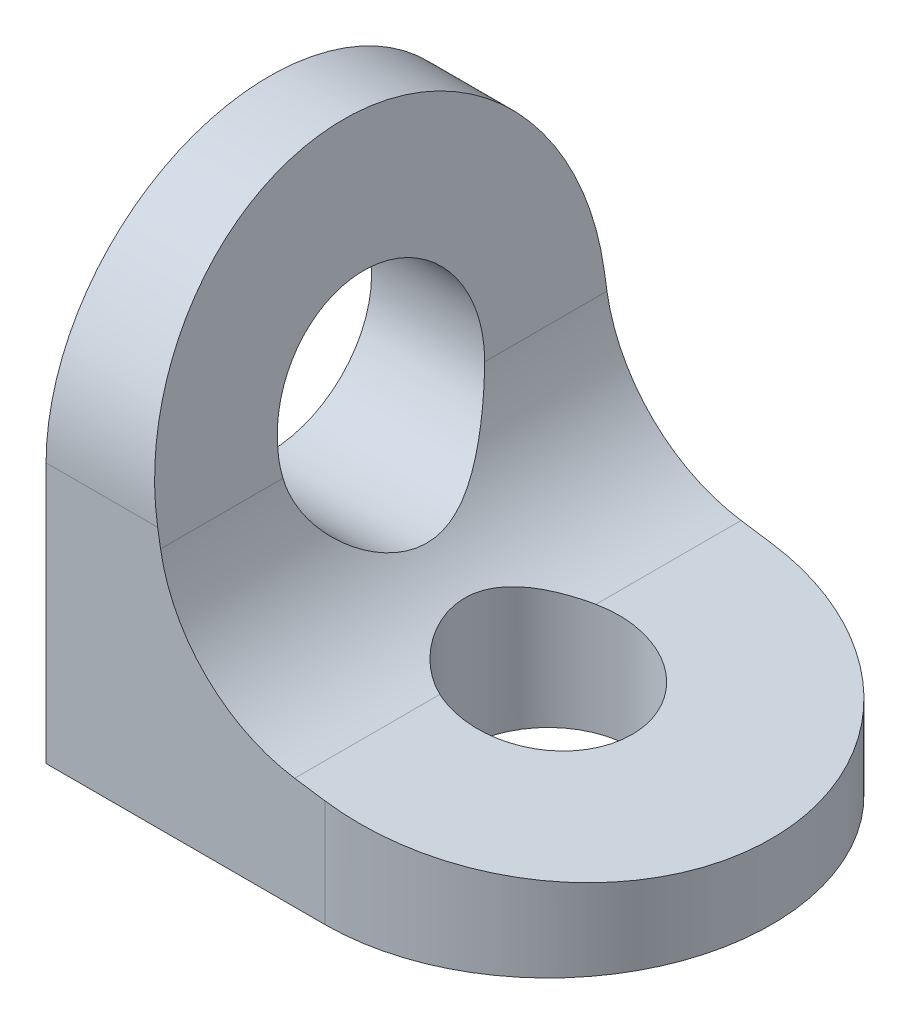
ISO-10303-21;
HEADER;
FILE_DESCRIPTION(('STEP AP214'),'2;1');
FILE_NAME('part.step','',(''),(''),'','','');
FILE_SCHEMA(('AUTOMOTIVE_DESIGN { 1 0 10303 214 1 1 1 1 }'));
ENDSEC;
DATA;
#1=APPLICATION_CONTEXT('core data for automotive mechanical design processes');
#2=APPLICATION_PROTOCOL_DEFINITION('international standard','automotive_design',2000,#1);
#3=PRODUCT_CONTEXT('',#1,'mechanical');
#4=PRODUCT('Part','Part','',(#3));
#5=PRODUCT_RELATED_PRODUCT_CATEGORY('part','',(#4));
#6=PRODUCT_DEFINITION_FORMATION('','',#4);
#7=PRODUCT_DEFINITION_CONTEXT('part definition',#1,'design');
#8=PRODUCT_DEFINITION('design','',#6,#7);
#9=PRODUCT_DEFINITION_SHAPE('','',#8);
#10=(LENGTH_UNIT() NAMED_UNIT(*) SI_UNIT(.MILLI.,.METRE.));
#11=(NAMED_UNIT(*) PLANE_ANGLE_UNIT() SI_UNIT($,.RADIAN.));
#12=(NAMED_UNIT(*) SI_UNIT($,.STERADIAN.) SOLID_ANGLE_UNIT());
#13=UNCERTAINTY_MEASURE_WITH_UNIT(LENGTH_MEASURE(1.E-05),#10,'distance_accuracy_value','');
#14=(GEOMETRIC_REPRESENTATION_CONTEXT(3) GLOBAL_UNCERTAINTY_ASSIGNED_CONTEXT((#13)) GLOBAL_UNIT_ASSIGNED_CONTEXT((#10,
#11,#12)) REPRESENTATION_CONTEXT('',''));
#15=CARTESIAN_POINT('',(0.,0.,0.));
#16=DIRECTION('',(0.,0.,1.));
#17=DIRECTION('',(1.,0.,0.));
#18=AXIS2_PLACEMENT_3D('',#15,#16,#17);
#19=CARTESIAN_POINT('',(7.5,0.,0.));
#20=DIRECTION('',(0.,1.,0.));
#21=DIRECTION('',(0.,0.,1.));
#22=AXIS2_PLACEMENT_3D('',#19,#20,#21);
#23=CYLINDRICAL_SURFACE('',#22,6.);
#24=DIRECTION('',(0.,-1.,0.));
#25=VECTOR('',#24,1.);
#26=CARTESIAN_POINT('',(7.5,0.,6.));
#27=LINE('',#26,#25);
#28=CARTESIAN_POINT('',(7.5,0.,6.));
#29=VERTEX_POINT('',#28);
#30=CARTESIAN_POINT('',(7.5,2.88010243541644,6.));
#31=VERTEX_POINT('',#30);
#32=EDGE_CURVE('E148',#29,#31,#27,.F.);
#33=ORIENTED_EDGE('',*,*,#32,.F.);
#34=CARTESIAN_POINT('',(7.5,0.,0.));
#35=DIRECTION('',(0.,1.,0.));
#36=DIRECTION('',(-1.,0.,0.));
#37=AXIS2_PLACEMENT_3D('',#34,#35,#36);
#38=CIRCLE('',#37,6.);
#39=CARTESIAN_POINT('',(7.5,0.,-6.));
#40=VERTEX_POINT('',#39);
#41=EDGE_CURVE('E154',#40,#29,#38,.F.);
#42=ORIENTED_EDGE('',*,*,#41,.F.);
#43=DIRECTION('',(0.,1.,0.));
#44=VECTOR('',#43,1.);
#45=CARTESIAN_POINT('',(7.5,7.240095636341,-6.));
#46=LINE('',#45,#44);
#47=CARTESIAN_POINT('',(7.5,2.88010243541644,-6.));
#48=VERTEX_POINT('',#47);
#49=EDGE_CURVE('E151',#48,#40,#46,.F.);
#50=ORIENTED_EDGE('',*,*,#49,.F.);
#51=CARTESIAN_POINT('',(7.5,2.88010243541644,0.));
#52=DIRECTION('',(-0.145130723511439,-0.989412488850351,0.));
#53=DIRECTION('',(-0.989412488850351,0.145130723511439,0.));
#54=AXIS2_PLACEMENT_3D('',#51,#52,#53);
#55=ELLIPSE('',#54,6.06420483631828,6.);
#56=EDGE_CURVE('E50',#31,#48,#55,.F.);
#57=ORIENTED_EDGE('',*,*,#56,.F.);
#58=EDGE_LOOP('',(#33,#42,#50,#57));
#59=FACE_BOUND('',#58,.T.);
#60=ADVANCED_FACE('F36',(#59),#23,.T.);
#61=CARTESIAN_POINT('',(3.,7.,0.));
#62=DIRECTION('',(-1.,0.,0.));
#63=DIRECTION('',(0.,0.,1.));
#64=AXIS2_PLACEMENT_3D('',#61,#62,#63);
#65=CYLINDRICAL_SURFACE('',#64,6.);
#66=DIRECTION('',(1.,0.,0.));
#67=VECTOR('',#66,1.);
#68=CARTESIAN_POINT('',(3.,7.,6.));
#69=LINE('',#68,#67);
#70=CARTESIAN_POINT('',(3.,7.,6.));
#71=VERTEX_POINT('',#70);
#72=CARTESIAN_POINT('',(0.,7.,6.));
#73=VERTEX_POINT('',#72);
#74=EDGE_CURVE('E138',#71,#73,#69,.F.);
#75=ORIENTED_EDGE('',*,*,#74,.F.);
#76=CARTESIAN_POINT('',(3.,7.,0.));
#77=DIRECTION('',(-0.986393923832144,-0.164398987305357,0.));
#78=DIRECTION('',(-0.164398987305357,0.986393923832144,0.));
#79=AXIS2_PLACEMENT_3D('',#76,#77,#78);
#80=ELLIPSE('',#79,6.08276253029822,6.);
#81=CARTESIAN_POINT('',(3.,7.,-6.));
#82=VERTEX_POINT('',#81);
#83=EDGE_CURVE('E144',#82,#71,#80,.F.);
#84=ORIENTED_EDGE('',*,*,#83,.F.);
#85=DIRECTION('',(-1.,0.,0.));
#86=VECTOR('',#85,1.);
#87=CARTESIAN_POINT('',(7.30456483493455,7.,-6.));
#88=LINE('',#87,#86);
#89=CARTESIAN_POINT('',(0.,7.,-6.));
#90=VERTEX_POINT('',#89);
#91=EDGE_CURVE('E141',#90,#82,#88,.F.);
#92=ORIENTED_EDGE('',*,*,#91,.F.);
#93=CARTESIAN_POINT('',(0.,7.,0.));
#94=DIRECTION('',(1.,0.,0.));
#95=DIRECTION('',(0.,0.,-1.));
#96=AXIS2_PLACEMENT_3D('',#93,#94,#95);
#97=CIRCLE('',#96,6.);
#98=EDGE_CURVE('E146',#73,#90,#97,.F.);
#99=ORIENTED_EDGE('',*,*,#98,.F.);
#100=EDGE_LOOP('',(#75,#84,#92,#99));
#101=FACE_BOUND('',#100,.T.);
#102=ADVANCED_FACE('F207',(#101),#65,.T.);
#103=CARTESIAN_POINT('',(13.5,0.,6.));
#104=DIRECTION('',(0.,1.,0.));
#105=DIRECTION('',(-1.,0.,0.));
#106=AXIS2_PLACEMENT_3D('',#103,#104,#105);
#107=PLANE('',#106);
#108=CARTESIAN_POINT('',(7.5,0.,0.));
#109=DIRECTION('',(0.,-1.,0.));
#110=DIRECTION('',(1.,0.,0.));
#111=AXIS2_PLACEMENT_3D('',#108,#109,#110);
#112=CIRCLE('',#111,2.25);
#113=CARTESIAN_POINT('',(9.75,0.,0.));
#114=VERTEX_POINT('',#113);
#115=EDGE_CURVE('E124',#114,#114,#112,.T.);
#116=ORIENTED_EDGE('',*,*,#115,.F.);
#117=EDGE_LOOP('',(#116));
#118=FACE_BOUND('',#117,.T.);
#119=DIRECTION('',(1.,0.,0.));
#120=VECTOR('',#119,1.);
#121=CARTESIAN_POINT('',(13.5,0.,-6.));
#122=LINE('',#121,#120);
#123=CARTESIAN_POINT('',(0.,0.,-6.));
#124=VERTEX_POINT('',#123);
#125=EDGE_CURVE('E174',#124,#40,#122,.T.);
#126=ORIENTED_EDGE('',*,*,#125,.T.);
#127=ORIENTED_EDGE('',*,*,#41,.T.);
#128=DIRECTION('',(1.,0.,0.));
#129=VECTOR('',#128,1.);
#130=CARTESIAN_POINT('',(13.5,0.,6.));
#131=LINE('',#130,#129);
#132=CARTESIAN_POINT('',(0.,0.,6.));
#133=VERTEX_POINT('',#132);
#134=EDGE_CURVE('E183',#133,#29,#131,.T.);
#135=ORIENTED_EDGE('',*,*,#134,.F.);
#136=DIRECTION('',(0.,0.,-1.));
#137=VECTOR('',#136,1.);
#138=CARTESIAN_POINT('',(0.,0.,6.));
#139=LINE('',#138,#137);
#140=EDGE_CURVE('E133',#133,#124,#139,.T.);
#141=ORIENTED_EDGE('',*,*,#140,.T.);
#142=EDGE_LOOP('',(#126,#127,#135,#141));
#143=FACE_BOUND('',#142,.T.);
#144=ADVANCED_FACE('F201',(#118,#143),#107,.F.);
#145=CARTESIAN_POINT('',(6.6826117522775,3.,6.));
#146=DIRECTION('',(-0.145130723511439,-0.989412488850351,0.));
#147=DIRECTION('',(0.989412488850351,-0.145130723511439,0.));
#148=AXIS2_PLACEMENT_3D('',#145,#146,#147);
#149=PLANE('',#148);
#150=DIRECTION('',(0.,0.,-1.));
#151=VECTOR('',#150,1.);
#152=CARTESIAN_POINT('',(6.6826117522775,3.,6.));
#153=LINE('',#152,#151);
#154=CARTESIAN_POINT('',(6.6826117522775,3.,-2.0962768072192));
#155=VERTEX_POINT('',#154);
#156=CARTESIAN_POINT('',(6.6826117522775,3.,-6.));
#157=VERTEX_POINT('',#156);
#158=EDGE_CURVE('E129',#155,#157,#153,.T.);
#159=ORIENTED_EDGE('',*,*,#158,.F.);
#160=CARTESIAN_POINT('',(7.5,2.88010243541644,0.));
#161=DIRECTION('',(-0.145130723511439,-0.989412488850351,0.));
#162=DIRECTION('',(0.989412488850351,-0.145130723511439,0.));
#163=AXIS2_PLACEMENT_3D('',#160,#161,#162);
#164=ELLIPSE('',#163,2.27407681361935,2.25);
#165=CARTESIAN_POINT('',(6.6826117522775,3.,2.0962768072192));
#166=VERTEX_POINT('',#165);
#167=EDGE_CURVE('E63',#155,#166,#164,.T.);
#168=ORIENTED_EDGE('',*,*,#167,.T.);
#169=CARTESIAN_POINT('',(6.6826117522775,3.,6.));
#170=VERTEX_POINT('',#169);
#171=EDGE_CURVE('E131',#170,#166,#153,.T.);
#172=ORIENTED_EDGE('',*,*,#171,.F.);
#173=DIRECTION('',(-0.989412488850351,0.145130723511439,0.));
#174=VECTOR('',#173,1.);
#175=CARTESIAN_POINT('',(6.6826117522775,3.,6.));
#176=LINE('',#175,#174);
#177=EDGE_CURVE('E165',#31,#170,#176,.T.);
#178=ORIENTED_EDGE('',*,*,#177,.F.);
#179=ORIENTED_EDGE('',*,*,#56,.T.);
#180=DIRECTION('',(-0.989412488850351,0.145130723511439,0.));
#181=VECTOR('',#180,1.);
#182=CARTESIAN_POINT('',(6.6826117522775,3.,-6.));
#183=LINE('',#182,#181);
#184=EDGE_CURVE('E162',#48,#157,#183,.T.);
#185=ORIENTED_EDGE('',*,*,#184,.T.);
#186=EDGE_LOOP('',(#159,#168,#172,#178,#179,#185));
#187=FACE_BOUND('',#186,.T.);
#188=ADVANCED_FACE('F160',(#187),#149,.F.);
#189=CARTESIAN_POINT('',(7.30456483493455,7.240095636341,6.));
#190=DIRECTION('',(0.,0.,-1.));
#191=DIRECTION('',(-1.,0.,0.));
#192=AXIS2_PLACEMENT_3D('',#189,#190,#191);
#193=CYLINDRICAL_SURFACE('',#192,4.28546807739185);
#194=DIRECTION('',(0.,0.,-1.));
#195=VECTOR('',#194,1.);
#196=CARTESIAN_POINT('',(3.07740516261861,6.53556902428835,6.));
#197=LINE('',#196,#195);
#198=CARTESIAN_POINT('',(3.07740516261861,6.53556902428835,-2.71049882287367));
#199=VERTEX_POINT('',#198);
#200=CARTESIAN_POINT('',(3.07740516261861,6.53556902428835,-6.));
#201=VERTEX_POINT('',#200);
#202=EDGE_CURVE('E123',#199,#201,#197,.T.);
#203=ORIENTED_EDGE('',*,*,#202,.F.);
#204=CARTESIAN_POINT('',(3.07740516261861,6.53556902428835,-2.71049882287367));
#205=CARTESIAN_POINT('',(3.08987440764048,6.46066331149666,-2.69767525959736));
#206=CARTESIAN_POINT('',(3.10427279355863,6.38663690236073,-2.68178471042402));
#207=CARTESIAN_POINT('',(3.13654207558916,6.24092001866603,-2.64422693394715));
#208=CARTESIAN_POINT('',(3.15440942066139,6.16922724215267,-2.62256560560009));
#209=CARTESIAN_POINT('',(3.19311823790316,6.02910537502468,-2.57397120822949));
#210=CARTESIAN_POINT('',(3.21393742673688,5.96065654154899,-2.54707712081963));
#211=CARTESIAN_POINT('',(3.2582187884953,5.82683913544833,-2.48828032655013));
#212=CARTESIAN_POINT('',(3.28168159545002,5.76147130710815,-2.45637641743859));
#213=CARTESIAN_POINT('',(3.35517414566293,5.57097041047899,-2.35395104155999));
#214=CARTESIAN_POINT('',(3.40850254723425,5.45076026854337,-2.27647549931217));
#215=CARTESIAN_POINT('',(3.52033353313102,5.22495504711143,-2.10520587998474));
#216=CARTESIAN_POINT('',(3.57884974054009,5.1194004344491,-2.01136817242958));
#217=CARTESIAN_POINT('',(3.70469921832662,4.91140614937844,-1.79597196487917));
#218=CARTESIAN_POINT('',(3.77219235428233,4.81114298077279,-1.67239697500034));
#219=CARTESIAN_POINT('',(3.90200956049022,4.63241016186594,-1.40799132837073));
#220=CARTESIAN_POINT('',(3.96433928299635,4.5539164539663,-1.26717996980634));
#221=CARTESIAN_POINT('',(4.06101597742606,4.43853045895188,-1.00794578394057));
#222=CARTESIAN_POINT('',(4.09843232398134,4.39612953792535,-0.893134775889717));
#223=CARTESIAN_POINT('',(4.16153864770797,4.32653358762529,-0.655966793331067));
#224=CARTESIAN_POINT('',(4.1872490012245,4.29931211712864,-0.533623355164968));
#225=CARTESIAN_POINT('',(4.22321972631063,4.26162667333188,-0.28284085578559));
#226=CARTESIAN_POINT('',(4.23333500585242,4.25132001418111,-0.154355882917913));
#227=CARTESIAN_POINT('',(4.23566983636793,4.24892028319338,0.102943633434673));
#228=CARTESIAN_POINT('',(4.22789342660024,4.2568231003543,0.23175809597507));
#229=CARTESIAN_POINT('',(4.19804962382358,4.28795139131116,0.468786153819118));
#230=CARTESIAN_POINT('',(4.17792016683103,4.30910602762401,0.577540229174006));
#231=CARTESIAN_POINT('',(4.12778821387066,4.36351891823895,0.789600970273507));
#232=CARTESIAN_POINT('',(4.09777690903174,4.39678797438206,0.892902679995585));
#233=CARTESIAN_POINT('',(4.01516248947858,4.49224957099914,1.13947699607111));
#234=CARTESIAN_POINT('',(3.95854525976668,4.5606972136002,1.2789798309741));
#235=CARTESIAN_POINT('',(3.8382649422487,4.71822016295492,1.54261176976718));
#236=CARTESIAN_POINT('',(3.77458564815061,4.80734345049364,1.6667040667248));
#237=CARTESIAN_POINT('',(3.64524056235006,5.00649285608887,1.90065382275666));
#238=CARTESIAN_POINT('',(3.57956041748734,5.11689838463556,2.0101802599202));
#239=CARTESIAN_POINT('',(3.45312486059271,5.35599487374211,2.20995227035137));
#240=CARTESIAN_POINT('',(3.39235549796115,5.48463095559965,2.30025374527206));
#241=CARTESIAN_POINT('',(3.30854958664232,5.69006130266705,2.41926512823591));
#242=CARTESIAN_POINT('',(3.28181927023898,5.76068318633839,2.45621999367865));
#243=CARTESIAN_POINT('',(3.23139750068639,5.90576664348084,2.52419601370502));
#244=CARTESIAN_POINT('',(3.20770508839282,5.98022699458785,2.55521904264878));
#245=CARTESIAN_POINT('',(3.16375130995181,6.13317618943728,2.61109035438997));
#246=CARTESIAN_POINT('',(3.14352019200361,6.21169344099219,2.63588500762987));
#247=CARTESIAN_POINT('',(3.10720893074011,6.37163542007011,2.67853339545782));
#248=CARTESIAN_POINT('',(3.09113444197137,6.45306393846997,2.69637769152307));
#249=CARTESIAN_POINT('',(3.07740516261861,6.53556902428835,2.71049882287367));
#250=B_SPLINE_CURVE_WITH_KNOTS('',3,(#204,#205,#206,#207,#208,#209,#210,#211,#212,#213,#214,
#215,#216,#217,#218,#219,#220,#221,#222,#223,#224,#225,#226,#227,#228,#229,#230,#231,#232,#233,
#234,#235,#236,#237,#238,#239,#240,#241,#242,#243,#244,#245,#246,#247,#248,#249),.UNSPECIFIED.,
.F.,.F.,(4,2,2,2,2,2,2,2,2,2,2,2,2,2,2,2,2,2,2,2,2,2,4),(0.,0.230898062870561,0.461560998758956,
0.690567203686465,0.919628449513881,1.3755375929064,1.83268156857596,2.3490698341341,
2.86488514027074,3.2474653596652,3.62937706054055,4.01482096149634,4.40017785251238,
4.73665233598125,5.0734275750468,5.56692224270193,6.06157379830476,6.5660329617752,
7.06900461341814,7.32092156735054,7.5727587877561,7.82669536529045,8.0809755940411),.UNSPECIFIED.);
#251=CARTESIAN_POINT('',(3.07740516261861,6.53556902428835,2.71049882287367));
#252=VERTEX_POINT('',#251);
#253=EDGE_CURVE('E56',#199,#252,#250,.T.);
#254=ORIENTED_EDGE('',*,*,#253,.T.);
#255=CARTESIAN_POINT('',(3.07740516261861,6.53556902428835,6.));
#256=VERTEX_POINT('',#255);
#257=EDGE_CURVE('E120',#256,#252,#197,.T.);
#258=ORIENTED_EDGE('',*,*,#257,.F.);
#259=CARTESIAN_POINT('',(7.30456483493455,7.240095636341,6.));
#260=DIRECTION('',(0.,0.,-1.));
#261=DIRECTION('',(1.,0.,0.));
#262=AXIS2_PLACEMENT_3D('',#259,#260,#261);
#263=CIRCLE('',#262,4.28546807739185);
#264=EDGE_CURVE('E192',#170,#256,#263,.T.);
#265=ORIENTED_EDGE('',*,*,#264,.F.);
#266=ORIENTED_EDGE('',*,*,#171,.T.);
#267=CARTESIAN_POINT('',(6.6826117522775,3.,2.0962768072192));
#268=CARTESIAN_POINT('',(6.62302269416665,3.00873588391241,2.0730420086905));
#269=CARTESIAN_POINT('',(6.56461045494653,3.01859281787305,2.04733724811623));
#270=CARTESIAN_POINT('',(6.45048631815838,3.0401968075996,1.99124656053453));
#271=CARTESIAN_POINT('',(6.39477279127688,3.05194270394489,1.96086350548716));
#272=CARTESIAN_POINT('',(6.23246120551858,3.08941972856589,1.86325903797464));
#273=CARTESIAN_POINT('',(6.13028287947847,3.11745431721928,1.7894209606914));
#274=CARTESIAN_POINT('',(5.94033508274899,3.17635162439145,1.62652997803264));
#275=CARTESIAN_POINT('',(5.85253849654255,3.20720884574312,1.53750636626647));
#276=CARTESIAN_POINT('',(5.69266333427221,3.26840293752566,1.34595849669832));
#277=CARTESIAN_POINT('',(5.62060188207781,3.29873920828755,1.24341972354293));
#278=CARTESIAN_POINT('',(5.49146676878682,3.35639486371246,1.02241701180815));
#279=CARTESIAN_POINT('',(5.4351332090873,3.38353838368748,0.903470908241932));
#280=CARTESIAN_POINT('',(5.34377897278891,3.42916435156522,0.656150118119603));
#281=CARTESIAN_POINT('',(5.30873152227884,3.44765767302464,0.527787504604756));
#282=CARTESIAN_POINT('',(5.26373211819441,3.47169519414857,0.276602576011877));
#283=CARTESIAN_POINT('',(5.25194137154277,3.47818539121497,0.154202507965733));
#284=CARTESIAN_POINT('',(5.24850321182713,3.48006109151809,-0.0909485438570141));
#285=CARTESIAN_POINT('',(5.2568484893177,3.47545062433508,-0.21369938414519));
#286=CARTESIAN_POINT('',(5.29155995401261,3.45679398910078,-0.444664994089437));
#287=CARTESIAN_POINT('',(5.31627312976959,3.44361520457574,-0.553207430244121));
#288=CARTESIAN_POINT('',(5.38098195658696,3.41042475721085,-0.764512650486011));
#289=CARTESIAN_POINT('',(5.42098120006069,3.39041148830111,-0.867274069445735));
#290=CARTESIAN_POINT('',(5.51801264258134,3.34439023923402,-1.07135391730058));
#291=CARTESIAN_POINT('',(5.57596715892304,3.31808171255001,-1.1721639131797));
#292=CARTESIAN_POINT('',(5.70635221529365,3.2631678687687,-1.36335394069294));
#293=CARTESIAN_POINT('',(5.77879759366186,3.23456021552522,-1.45372313028055));
#294=CARTESIAN_POINT('',(5.94545856763213,3.17478622908905,-1.63167221787034));
#295=CARTESIAN_POINT('',(6.04119075139233,3.14368360845483,-1.7178578126447));
#296=CARTESIAN_POINT('',(6.24670040466863,3.08588352934561,-1.87302869429389));
#297=CARTESIAN_POINT('',(6.35644531966532,3.05917617888946,-1.94205278885386));
#298=CARTESIAN_POINT('',(6.50599033010685,3.02954407829237,-2.01889384903648));
#299=CARTESIAN_POINT('',(6.54069813418587,3.0231035112723,-2.03561580443161));
#300=CARTESIAN_POINT('',(6.61099882756875,3.01097407033218,-2.06728266967561));
#301=CARTESIAN_POINT('',(6.64659076593024,3.00528442708447,-2.08222939666392));
#302=CARTESIAN_POINT('',(6.68261175227745,2.99999999999998,-2.09627680721929));
#303=B_SPLINE_CURVE_WITH_KNOTS('',3,(#267,#268,#269,#270,#271,#272,#273,#274,#275,#276,#277,
#278,#279,#280,#281,#282,#283,#284,#285,#286,#287,#288,#289,#290,#291,#292,#293,#294,#295,#296,
#297,#298,#299,#300,#301,#302),.UNSPECIFIED.,.F.,.F.,(4,2,2,2,2,2,2,2,2,2,2,2,2,2,2,2,2,4),(0.,
0.193508494748534,0.386898666651203,0.772363474998494,1.15709294303915,1.54223903171104,
1.94325837373023,2.34377225874795,2.71109939148214,3.07829320327623,3.41312600281484,
3.74803754060561,4.10427235470172,4.4608738305859,4.85660721058841,5.25143739996305,
5.36857763389514,5.485596909346),.UNSPECIFIED.);
#304=EDGE_CURVE('E11',#166,#155,#303,.T.);
#305=ORIENTED_EDGE('',*,*,#304,.T.);
#306=ORIENTED_EDGE('',*,*,#158,.T.);
#307=CARTESIAN_POINT('',(7.30456483493455,7.240095636341,-6.));
#308=DIRECTION('',(0.,0.,-1.));
#309=DIRECTION('',(1.,0.,0.));
#310=AXIS2_PLACEMENT_3D('',#307,#308,#309);
#311=CIRCLE('',#310,4.28546807739185);
#312=EDGE_CURVE('E173',#157,#201,#311,.T.);
#313=ORIENTED_EDGE('',*,*,#312,.T.);
#314=EDGE_LOOP('',(#203,#254,#258,#265,#266,#305,#306,#313));
#315=FACE_BOUND('',#314,.T.);
#316=ADVANCED_FACE('F118',(#315),#193,.F.);
#317=CARTESIAN_POINT('',(2.,13.,6.));
#318=DIRECTION('',(-0.986393923832144,-0.164398987305357,0.));
#319=DIRECTION('',(0.164398987305357,-0.986393923832144,0.));
#320=AXIS2_PLACEMENT_3D('',#317,#318,#319);
#321=PLANE('',#320);
#322=ORIENTED_EDGE('',*,*,#257,.T.);
#323=CARTESIAN_POINT('',(3.,7.,0.));
#324=DIRECTION('',(-0.986393923832144,-0.164398987305357,0.));
#325=DIRECTION('',(-0.164398987305357,0.986393923832144,0.));
#326=AXIS2_PLACEMENT_3D('',#323,#324,#325);
#327=ELLIPSE('',#326,2.78793282638668,2.75);
#328=EDGE_CURVE('E109',#252,#199,#327,.T.);
#329=ORIENTED_EDGE('',*,*,#328,.T.);
#330=ORIENTED_EDGE('',*,*,#202,.T.);
#331=DIRECTION('',(-0.164398987305357,0.986393923832144,0.));
#332=VECTOR('',#331,1.);
#333=CARTESIAN_POINT('',(2.,13.,-6.));
#334=LINE('',#333,#332);
#335=EDGE_CURVE('E176',#201,#82,#334,.T.);
#336=ORIENTED_EDGE('',*,*,#335,.T.);
#337=ORIENTED_EDGE('',*,*,#83,.T.);
#338=DIRECTION('',(-0.164398987305357,0.986393923832144,0.));
#339=VECTOR('',#338,1.);
#340=CARTESIAN_POINT('',(2.,13.,6.));
#341=LINE('',#340,#339);
#342=EDGE_CURVE('E128',#256,#71,#341,.T.);
#343=ORIENTED_EDGE('',*,*,#342,.F.);
#344=EDGE_LOOP('',(#322,#329,#330,#336,#337,#343));
#345=FACE_BOUND('',#344,.T.);
#346=ADVANCED_FACE('F126',(#345),#321,.F.);
#347=CARTESIAN_POINT('',(0.,0.,6.));
#348=DIRECTION('',(1.,0.,0.));
#349=DIRECTION('',(0.,0.,-1.));
#350=AXIS2_PLACEMENT_3D('',#347,#348,#349);
#351=PLANE('',#350);
#352=CARTESIAN_POINT('',(0.,7.,0.));
#353=DIRECTION('',(-1.,0.,0.));
#354=DIRECTION('',(0.,0.,1.));
#355=AXIS2_PLACEMENT_3D('',#352,#353,#354);
#356=CIRCLE('',#355,2.75);
#357=CARTESIAN_POINT('',(0.,7.,2.75));
#358=VERTEX_POINT('',#357);
#359=EDGE_CURVE('E114',#358,#358,#356,.T.);
#360=ORIENTED_EDGE('',*,*,#359,.F.);
#361=EDGE_LOOP('',(#360));
#362=FACE_BOUND('',#361,.T.);
#363=DIRECTION('',(0.,-1.,0.));
#364=VECTOR('',#363,1.);
#365=CARTESIAN_POINT('',(0.,0.,6.));
#366=LINE('',#365,#364);
#367=EDGE_CURVE('E198',#73,#133,#366,.T.);
#368=ORIENTED_EDGE('',*,*,#367,.F.);
#369=ORIENTED_EDGE('',*,*,#98,.T.);
#370=DIRECTION('',(0.,-1.,0.));
#371=VECTOR('',#370,1.);
#372=CARTESIAN_POINT('',(0.,0.,-6.));
#373=LINE('',#372,#371);
#374=EDGE_CURVE('E182',#90,#124,#373,.T.);
#375=ORIENTED_EDGE('',*,*,#374,.T.);
#376=ORIENTED_EDGE('',*,*,#140,.F.);
#377=EDGE_LOOP('',(#368,#369,#375,#376));
#378=FACE_BOUND('',#377,.T.);
#379=ADVANCED_FACE('F206',(#362,#378),#351,.F.);
#380=CARTESIAN_POINT('',(7.30456483493455,7.240095636341,6.));
#381=DIRECTION('',(0.,0.,1.));
#382=DIRECTION('',(1.,0.,0.));
#383=AXIS2_PLACEMENT_3D('',#380,#381,#382);
#384=PLANE('',#383);
#385=ORIENTED_EDGE('',*,*,#134,.T.);
#386=ORIENTED_EDGE('',*,*,#32,.T.);
#387=ORIENTED_EDGE('',*,*,#177,.T.);
#388=ORIENTED_EDGE('',*,*,#264,.T.);
#389=ORIENTED_EDGE('',*,*,#342,.T.);
#390=ORIENTED_EDGE('',*,*,#74,.T.);
#391=ORIENTED_EDGE('',*,*,#367,.T.);
#392=EDGE_LOOP('',(#385,#386,#387,#388,#389,#390,#391));
#393=FACE_BOUND('',#392,.T.);
#394=ADVANCED_FACE('F205',(#393),#384,.T.);
#395=CARTESIAN_POINT('',(7.30456483493455,7.240095636341,-6.));
#396=DIRECTION('',(0.,0.,1.));
#397=DIRECTION('',(1.,0.,0.));
#398=AXIS2_PLACEMENT_3D('',#395,#396,#397);
#399=PLANE('',#398);
#400=ORIENTED_EDGE('',*,*,#184,.F.);
#401=ORIENTED_EDGE('',*,*,#49,.T.);
#402=ORIENTED_EDGE('',*,*,#125,.F.);
#403=ORIENTED_EDGE('',*,*,#374,.F.);
#404=ORIENTED_EDGE('',*,*,#91,.T.);
#405=ORIENTED_EDGE('',*,*,#335,.F.);
#406=ORIENTED_EDGE('',*,*,#312,.F.);
#407=EDGE_LOOP('',(#400,#401,#402,#403,#404,#405,#406));
#408=FACE_BOUND('',#407,.T.);
#409=ADVANCED_FACE('F171',(#408),#399,.F.);
#410=CARTESIAN_POINT('',(7.5,13.,0.));
#411=DIRECTION('',(0.,-1.,0.));
#412=DIRECTION('',(1.,0.,0.));
#413=AXIS2_PLACEMENT_3D('',#410,#411,#412);
#414=CYLINDRICAL_SURFACE('',#413,2.25);
#415=ORIENTED_EDGE('',*,*,#115,.T.);
#416=EDGE_LOOP('',(#415));
#417=FACE_BOUND('',#416,.T.);
#418=ORIENTED_EDGE('',*,*,#304,.F.);
#419=ORIENTED_EDGE('',*,*,#167,.F.);
#420=EDGE_LOOP('',(#418,#419));
#421=FACE_BOUND('',#420,.T.);
#422=ADVANCED_FACE('F233',(#417,#421),#414,.F.);
#423=CARTESIAN_POINT('',(13.5,7.,0.));
#424=DIRECTION('',(-1.,0.,0.));
#425=DIRECTION('',(0.,0.,1.));
#426=AXIS2_PLACEMENT_3D('',#423,#424,#425);
#427=CYLINDRICAL_SURFACE('',#426,2.75);
#428=ORIENTED_EDGE('',*,*,#359,.T.);
#429=EDGE_LOOP('',(#428));
#430=FACE_BOUND('',#429,.T.);
#431=ORIENTED_EDGE('',*,*,#328,.F.);
#432=ORIENTED_EDGE('',*,*,#253,.F.);
#433=EDGE_LOOP('',(#431,#432));
#434=FACE_BOUND('',#433,.T.);
#435=ADVANCED_FACE('F110',(#430,#434),#427,.F.);
#436=CLOSED_SHELL('',(#60,#102,#144,#188,#316,#346,#379,#394,#409,#422,#435));
#437=MANIFOLD_SOLID_BREP('B2',#436);
#438=ADVANCED_BREP_SHAPE_REPRESENTATION('',(#18,#437),#14);
#439=SHAPE_DEFINITION_REPRESENTATION(#9,#438);
ENDSEC;
END-ISO-10303-21;
